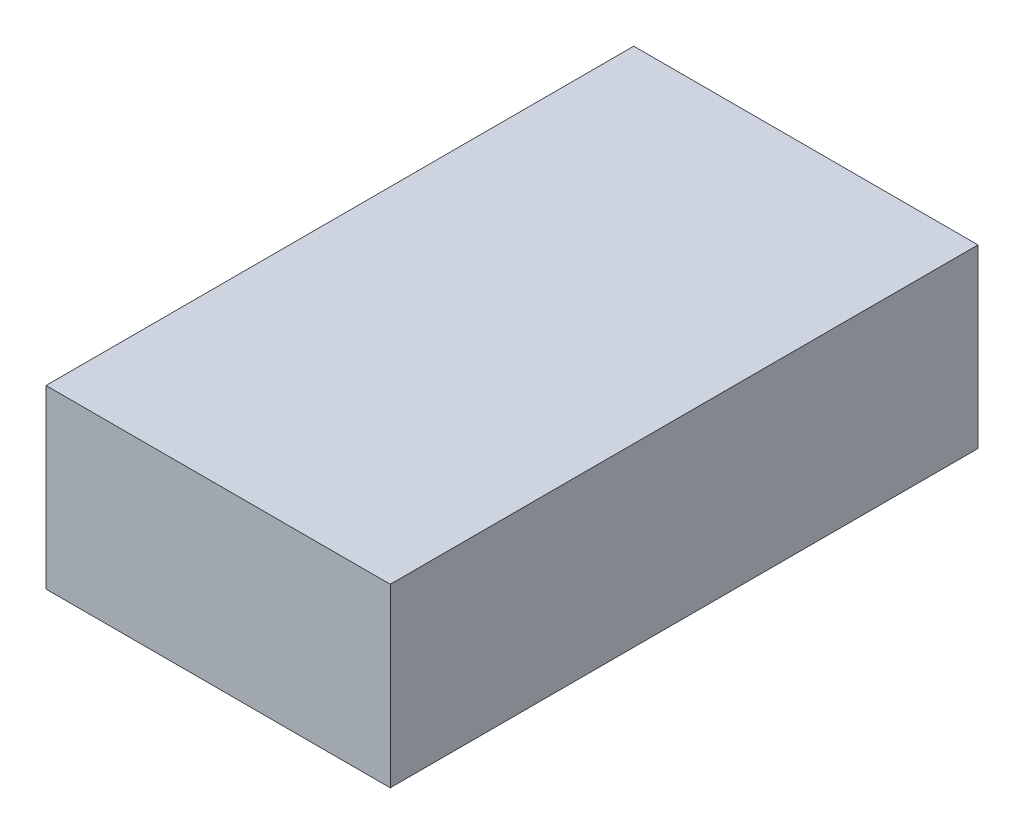
ISO-10303-21;
HEADER;
FILE_DESCRIPTION(('STEP AP214'),'2;1');
FILE_NAME('part.step','',(''),(''),'','','');
FILE_SCHEMA(('AUTOMOTIVE_DESIGN { 1 0 10303 214 1 1 1 1 }'));
ENDSEC;
DATA;
#1=APPLICATION_CONTEXT('core data for automotive mechanical design processes');
#2=APPLICATION_PROTOCOL_DEFINITION('international standard','automotive_design',2000,#1);
#3=PRODUCT_CONTEXT('',#1,'mechanical');
#4=PRODUCT('Part','Part','',(#3));
#5=PRODUCT_RELATED_PRODUCT_CATEGORY('part','',(#4));
#6=PRODUCT_DEFINITION_FORMATION('','',#4);
#7=PRODUCT_DEFINITION_CONTEXT('part definition',#1,'design');
#8=PRODUCT_DEFINITION('design','',#6,#7);
#9=PRODUCT_DEFINITION_SHAPE('','',#8);
#10=(LENGTH_UNIT() NAMED_UNIT(*) SI_UNIT(.MILLI.,.METRE.));
#11=(NAMED_UNIT(*) PLANE_ANGLE_UNIT() SI_UNIT($,.RADIAN.));
#12=(NAMED_UNIT(*) SI_UNIT($,.STERADIAN.) SOLID_ANGLE_UNIT());
#13=UNCERTAINTY_MEASURE_WITH_UNIT(LENGTH_MEASURE(1.E-05),#10,'distance_accuracy_value','');
#14=(GEOMETRIC_REPRESENTATION_CONTEXT(3) GLOBAL_UNCERTAINTY_ASSIGNED_CONTEXT((#13)) GLOBAL_UNIT_ASSIGNED_CONTEXT((#10,
#11,#12)) REPRESENTATION_CONTEXT('',''));
#15=CARTESIAN_POINT('',(0.,0.,0.));
#16=DIRECTION('',(0.,0.,1.));
#17=DIRECTION('',(1.,0.,0.));
#18=AXIS2_PLACEMENT_3D('',#15,#16,#17);
#19=CARTESIAN_POINT('',(20.5,10.5,70.));
#20=DIRECTION('',(-1.,0.,0.));
#21=DIRECTION('',(0.,0.,1.));
#22=AXIS2_PLACEMENT_3D('',#19,#20,#21);
#23=PLANE('',#22);
#24=DIRECTION('',(0.,1.,0.));
#25=VECTOR('',#24,1.);
#26=CARTESIAN_POINT('',(20.5,10.5,0.));
#27=LINE('',#26,#25);
#28=CARTESIAN_POINT('',(20.5,-10.5,0.));
#29=VERTEX_POINT('',#28);
#30=CARTESIAN_POINT('',(20.5,10.5,0.));
#31=VERTEX_POINT('',#30);
#32=EDGE_CURVE('E94',#29,#31,#27,.T.);
#33=ORIENTED_EDGE('',*,*,#32,.T.);
#34=DIRECTION('',(0.,0.,-1.));
#35=VECTOR('',#34,1.);
#36=CARTESIAN_POINT('',(20.5,10.5,70.));
#37=LINE('',#36,#35);
#38=CARTESIAN_POINT('',(20.5,10.5,70.));
#39=VERTEX_POINT('',#38);
#40=EDGE_CURVE('E11',#39,#31,#37,.T.);
#41=ORIENTED_EDGE('',*,*,#40,.F.);
#42=DIRECTION('',(0.,1.,0.));
#43=VECTOR('',#42,1.);
#44=CARTESIAN_POINT('',(20.5,10.5,70.));
#45=LINE('',#44,#43);
#46=CARTESIAN_POINT('',(20.5,-10.5,70.));
#47=VERTEX_POINT('',#46);
#48=EDGE_CURVE('E82',#47,#39,#45,.T.);
#49=ORIENTED_EDGE('',*,*,#48,.F.);
#50=DIRECTION('',(0.,0.,-1.));
#51=VECTOR('',#50,1.);
#52=CARTESIAN_POINT('',(20.5,-10.5,70.));
#53=LINE('',#52,#51);
#54=EDGE_CURVE('E90',#47,#29,#53,.T.);
#55=ORIENTED_EDGE('',*,*,#54,.T.);
#56=EDGE_LOOP('',(#33,#41,#49,#55));
#57=FACE_BOUND('',#56,.T.);
#58=ADVANCED_FACE('F31',(#57),#23,.F.);
#59=CARTESIAN_POINT('',(-20.5,10.5,70.));
#60=DIRECTION('',(0.,-1.,0.));
#61=DIRECTION('',(0.,0.,-1.));
#62=AXIS2_PLACEMENT_3D('',#59,#60,#61);
#63=PLANE('',#62);
#64=DIRECTION('',(-1.,0.,0.));
#65=VECTOR('',#64,1.);
#66=CARTESIAN_POINT('',(-20.5,10.5,0.));
#67=LINE('',#66,#65);
#68=CARTESIAN_POINT('',(-20.5,10.5,0.));
#69=VERTEX_POINT('',#68);
#70=EDGE_CURVE('E86',#31,#69,#67,.T.);
#71=ORIENTED_EDGE('',*,*,#70,.T.);
#72=DIRECTION('',(0.,0.,-1.));
#73=VECTOR('',#72,1.);
#74=CARTESIAN_POINT('',(-20.5,10.5,70.));
#75=LINE('',#74,#73);
#76=CARTESIAN_POINT('',(-20.5,10.5,70.));
#77=VERTEX_POINT('',#76);
#78=EDGE_CURVE('E39',#77,#69,#75,.T.);
#79=ORIENTED_EDGE('',*,*,#78,.F.);
#80=DIRECTION('',(-1.,0.,0.));
#81=VECTOR('',#80,1.);
#82=CARTESIAN_POINT('',(-20.5,10.5,70.));
#83=LINE('',#82,#81);
#84=EDGE_CURVE('E77',#39,#77,#83,.T.);
#85=ORIENTED_EDGE('',*,*,#84,.F.);
#86=ORIENTED_EDGE('',*,*,#40,.T.);
#87=EDGE_LOOP('',(#71,#79,#85,#86));
#88=FACE_BOUND('',#87,.T.);
#89=ADVANCED_FACE('F85',(#88),#63,.F.);
#90=CARTESIAN_POINT('',(-20.5,10.5,70.));
#91=DIRECTION('',(1.,0.,0.));
#92=DIRECTION('',(0.,0.,-1.));
#93=AXIS2_PLACEMENT_3D('',#90,#91,#92);
#94=PLANE('',#93);
#95=DIRECTION('',(0.,-1.,0.));
#96=VECTOR('',#95,1.);
#97=CARTESIAN_POINT('',(-20.5,10.5,0.));
#98=LINE('',#97,#96);
#99=CARTESIAN_POINT('',(-20.5,-10.5,0.));
#100=VERTEX_POINT('',#99);
#101=EDGE_CURVE('E64',#69,#100,#98,.T.);
#102=ORIENTED_EDGE('',*,*,#101,.T.);
#103=DIRECTION('',(0.,0.,-1.));
#104=VECTOR('',#103,1.);
#105=CARTESIAN_POINT('',(-20.5,-10.5,70.));
#106=LINE('',#105,#104);
#107=CARTESIAN_POINT('',(-20.5,-10.5,70.));
#108=VERTEX_POINT('',#107);
#109=EDGE_CURVE('E87',#108,#100,#106,.T.);
#110=ORIENTED_EDGE('',*,*,#109,.F.);
#111=DIRECTION('',(0.,-1.,0.));
#112=VECTOR('',#111,1.);
#113=CARTESIAN_POINT('',(-20.5,10.5,70.));
#114=LINE('',#113,#112);
#115=EDGE_CURVE('E80',#77,#108,#114,.T.);
#116=ORIENTED_EDGE('',*,*,#115,.F.);
#117=ORIENTED_EDGE('',*,*,#78,.T.);
#118=EDGE_LOOP('',(#102,#110,#116,#117));
#119=FACE_BOUND('',#118,.T.);
#120=ADVANCED_FACE('F88',(#119),#94,.F.);
#121=CARTESIAN_POINT('',(-20.5,-10.5,70.));
#122=DIRECTION('',(0.,1.,0.));
#123=DIRECTION('',(0.,0.,1.));
#124=AXIS2_PLACEMENT_3D('',#121,#122,#123);
#125=PLANE('',#124);
#126=DIRECTION('',(1.,0.,0.));
#127=VECTOR('',#126,1.);
#128=CARTESIAN_POINT('',(-20.5,-10.5,0.));
#129=LINE('',#128,#127);
#130=EDGE_CURVE('E70',#100,#29,#129,.T.);
#131=ORIENTED_EDGE('',*,*,#130,.T.);
#132=ORIENTED_EDGE('',*,*,#54,.F.);
#133=DIRECTION('',(1.,0.,0.));
#134=VECTOR('',#133,1.);
#135=CARTESIAN_POINT('',(-20.5,-10.5,70.));
#136=LINE('',#135,#134);
#137=EDGE_CURVE('E47',#108,#47,#136,.T.);
#138=ORIENTED_EDGE('',*,*,#137,.F.);
#139=ORIENTED_EDGE('',*,*,#109,.T.);
#140=EDGE_LOOP('',(#131,#132,#138,#139));
#141=FACE_BOUND('',#140,.T.);
#142=ADVANCED_FACE('F101',(#141),#125,.F.);
#143=CARTESIAN_POINT('',(20.5,-10.5,70.));
#144=DIRECTION('',(0.,0.,1.));
#145=DIRECTION('',(1.,0.,0.));
#146=AXIS2_PLACEMENT_3D('',#143,#144,#145);
#147=PLANE('',#146);
#148=ORIENTED_EDGE('',*,*,#48,.T.);
#149=ORIENTED_EDGE('',*,*,#84,.T.);
#150=ORIENTED_EDGE('',*,*,#115,.T.);
#151=ORIENTED_EDGE('',*,*,#137,.T.);
#152=EDGE_LOOP('',(#148,#149,#150,#151));
#153=FACE_BOUND('',#152,.T.);
#154=ADVANCED_FACE('F78',(#153),#147,.T.);
#155=CARTESIAN_POINT('',(20.5,-10.5,0.));
#156=DIRECTION('',(0.,0.,1.));
#157=DIRECTION('',(1.,0.,0.));
#158=AXIS2_PLACEMENT_3D('',#155,#156,#157);
#159=PLANE('',#158);
#160=ORIENTED_EDGE('',*,*,#32,.F.);
#161=ORIENTED_EDGE('',*,*,#130,.F.);
#162=ORIENTED_EDGE('',*,*,#101,.F.);
#163=ORIENTED_EDGE('',*,*,#70,.F.);
#164=EDGE_LOOP('',(#160,#161,#162,#163));
#165=FACE_BOUND('',#164,.T.);
#166=ADVANCED_FACE('F104',(#165),#159,.F.);
#167=CLOSED_SHELL('',(#58,#89,#120,#142,#154,#166));
#168=MANIFOLD_SOLID_BREP('B2',#167);
#169=ADVANCED_BREP_SHAPE_REPRESENTATION('',(#18,#168),#14);
#170=SHAPE_DEFINITION_REPRESENTATION(#9,#169);
ENDSEC;
END-ISO-10303-21;
